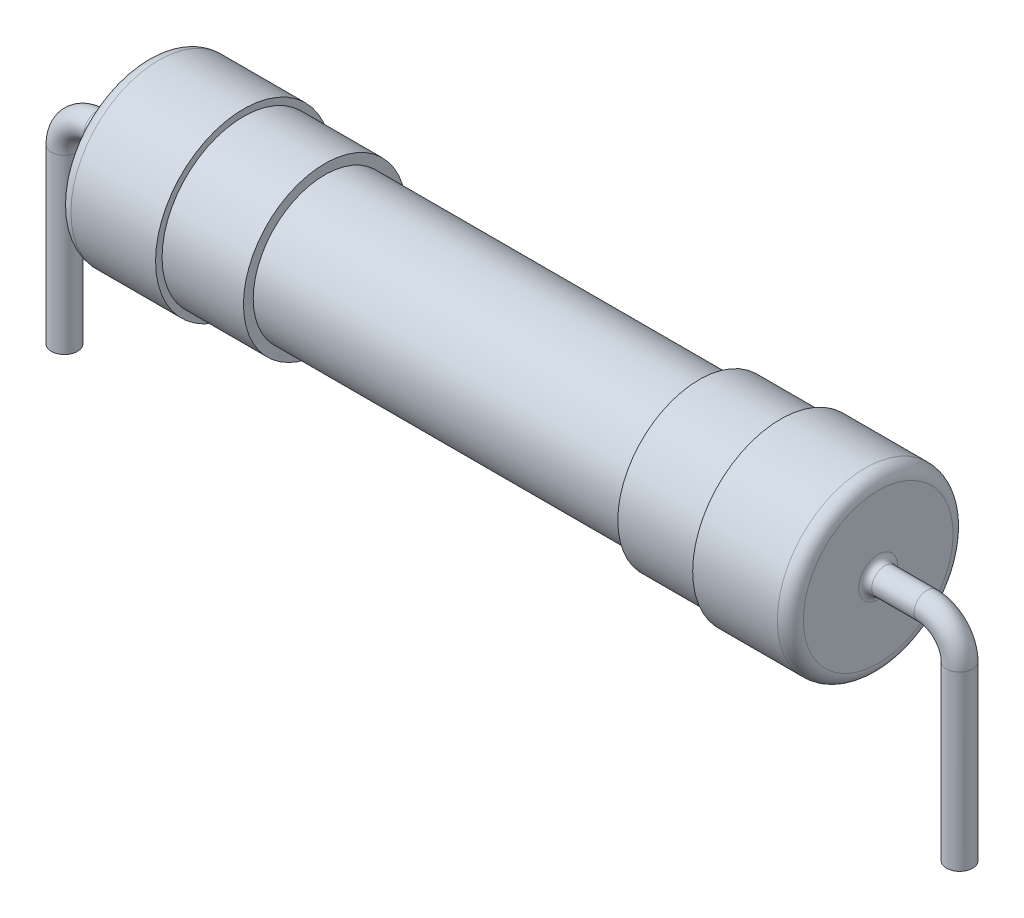
ISO-10303-21;
HEADER;
FILE_DESCRIPTION(('STEP AP214'),'2;1');
FILE_NAME('part.step','',(''),(''),'','','');
FILE_SCHEMA(('AUTOMOTIVE_DESIGN { 1 0 10303 214 1 1 1 1 }'));
ENDSEC;
DATA;
#1=APPLICATION_CONTEXT('core data for automotive mechanical design processes');
#2=APPLICATION_PROTOCOL_DEFINITION('international standard','automotive_design',2000,#1);
#3=PRODUCT_CONTEXT('',#1,'mechanical');
#4=PRODUCT('Part','Part','',(#3));
#5=PRODUCT_RELATED_PRODUCT_CATEGORY('part','',(#4));
#6=PRODUCT_DEFINITION_FORMATION('','',#4);
#7=PRODUCT_DEFINITION_CONTEXT('part definition',#1,'design');
#8=PRODUCT_DEFINITION('design','',#6,#7);
#9=PRODUCT_DEFINITION_SHAPE('','',#8);
#10=(LENGTH_UNIT() NAMED_UNIT(*) SI_UNIT(.MILLI.,.METRE.));
#11=(NAMED_UNIT(*) PLANE_ANGLE_UNIT() SI_UNIT($,.RADIAN.));
#12=(NAMED_UNIT(*) SI_UNIT($,.STERADIAN.) SOLID_ANGLE_UNIT());
#13=UNCERTAINTY_MEASURE_WITH_UNIT(LENGTH_MEASURE(1.E-05),#10,'distance_accuracy_value','');
#14=(GEOMETRIC_REPRESENTATION_CONTEXT(3) GLOBAL_UNCERTAINTY_ASSIGNED_CONTEXT((#13)) GLOBAL_UNIT_ASSIGNED_CONTEXT((#10,
#11,#12)) REPRESENTATION_CONTEXT('',''));
#15=CARTESIAN_POINT('',(0.,0.,0.));
#16=DIRECTION('',(0.,0.,1.));
#17=DIRECTION('',(1.,0.,0.));
#18=AXIS2_PLACEMENT_3D('',#15,#16,#17);
#19=CARTESIAN_POINT('',(13.75,-3.6,0.));
#20=DIRECTION('',(0.,-1.,0.));
#21=DIRECTION('',(1.,0.,0.));
#22=AXIS2_PLACEMENT_3D('',#19,#20,#21);
#23=PLANE('',#22);
#24=CARTESIAN_POINT('',(13.75,-3.6,0.));
#25=DIRECTION('',(0.,-1.,0.));
#26=DIRECTION('',(0.,0.,-1.));
#27=AXIS2_PLACEMENT_3D('',#24,#25,#26);
#28=CIRCLE('',#27,0.399999999999998);
#29=CARTESIAN_POINT('',(13.75,-3.6,-0.399999999999998));
#30=VERTEX_POINT('',#29);
#31=EDGE_CURVE('E276',#30,#30,#28,.F.);
#32=ORIENTED_EDGE('',*,*,#31,.F.);
#33=EDGE_LOOP('',(#32));
#34=FACE_BOUND('',#33,.T.);
#35=ADVANCED_FACE('F17',(#34),#23,.T.);
#36=CARTESIAN_POINT('',(13.75,1.7,0.));
#37=DIRECTION('',(0.,-1.,0.));
#38=DIRECTION('',(0.,0.,-1.));
#39=AXIS2_PLACEMENT_3D('',#36,#37,#38);
#40=CYLINDRICAL_SURFACE('',#39,0.399999999999998);
#41=CARTESIAN_POINT('',(13.75,1.7,0.));
#42=DIRECTION('',(0.,-1.,0.));
#43=DIRECTION('',(1.,0.,0.));
#44=AXIS2_PLACEMENT_3D('',#41,#42,#43);
#45=CIRCLE('',#44,0.399999999999998);
#46=CARTESIAN_POINT('',(14.15,1.7,0.));
#47=VERTEX_POINT('',#46);
#48=EDGE_CURVE('E274',#47,#47,#45,.F.);
#49=ORIENTED_EDGE('',*,*,#48,.F.);
#50=EDGE_LOOP('',(#49));
#51=FACE_BOUND('',#50,.T.);
#52=ORIENTED_EDGE('',*,*,#31,.T.);
#53=EDGE_LOOP('',(#52));
#54=FACE_BOUND('',#53,.T.);
#55=ADVANCED_FACE('F303',(#51,#54),#40,.T.);
#56=CARTESIAN_POINT('',(-13.75,-3.6,0.));
#57=DIRECTION('',(0.,-1.,0.));
#58=DIRECTION('',(1.,0.,0.));
#59=AXIS2_PLACEMENT_3D('',#56,#57,#58);
#60=PLANE('',#59);
#61=CARTESIAN_POINT('',(-13.75,-3.6,0.));
#62=DIRECTION('',(0.,-1.,0.));
#63=DIRECTION('',(0.,0.,-1.));
#64=AXIS2_PLACEMENT_3D('',#61,#62,#63);
#65=CIRCLE('',#64,0.399999999999998);
#66=CARTESIAN_POINT('',(-13.75,-3.6,-0.399999999999998));
#67=VERTEX_POINT('',#66);
#68=EDGE_CURVE('E273',#67,#67,#65,.F.);
#69=ORIENTED_EDGE('',*,*,#68,.F.);
#70=EDGE_LOOP('',(#69));
#71=FACE_BOUND('',#70,.T.);
#72=ADVANCED_FACE('F310',(#71),#60,.T.);
#73=CARTESIAN_POINT('',(-13.75,1.7,0.));
#74=DIRECTION('',(0.,-1.,0.));
#75=DIRECTION('',(0.,0.,-1.));
#76=AXIS2_PLACEMENT_3D('',#73,#74,#75);
#77=CYLINDRICAL_SURFACE('',#76,0.399999999999998);
#78=CARTESIAN_POINT('',(-13.75,1.7,0.));
#79=DIRECTION('',(0.,1.,0.));
#80=DIRECTION('',(-1.,0.,0.));
#81=AXIS2_PLACEMENT_3D('',#78,#79,#80);
#82=CIRCLE('',#81,0.399999999999998);
#83=CARTESIAN_POINT('',(-14.15,1.7,0.));
#84=VERTEX_POINT('',#83);
#85=EDGE_CURVE('E270',#84,#84,#82,.T.);
#86=ORIENTED_EDGE('',*,*,#85,.F.);
#87=EDGE_LOOP('',(#86));
#88=FACE_BOUND('',#87,.T.);
#89=ORIENTED_EDGE('',*,*,#68,.T.);
#90=EDGE_LOOP('',(#89));
#91=FACE_BOUND('',#90,.T.);
#92=ADVANCED_FACE('F265',(#88,#91),#77,.T.);
#93=CARTESIAN_POINT('',(12.75,1.7,0.));
#94=DIRECTION('',(0.,0.,-1.));
#95=DIRECTION('',(-1.,0.,0.));
#96=AXIS2_PLACEMENT_3D('',#93,#94,#95);
#97=TOROIDAL_SURFACE('',#96,0.999999999999999,0.399999999999998);
#98=CARTESIAN_POINT('',(12.75,2.7,0.));
#99=DIRECTION('',(1.,0.,0.));
#100=DIRECTION('',(0.,1.,0.));
#101=AXIS2_PLACEMENT_3D('',#98,#99,#100);
#102=CIRCLE('',#101,0.399999999999998);
#103=CARTESIAN_POINT('',(12.75,3.1,0.));
#104=VERTEX_POINT('',#103);
#105=EDGE_CURVE('E252',#104,#104,#102,.F.);
#106=ORIENTED_EDGE('',*,*,#105,.F.);
#107=EDGE_LOOP('',(#106));
#108=FACE_BOUND('',#107,.T.);
#109=ORIENTED_EDGE('',*,*,#48,.T.);
#110=EDGE_LOOP('',(#109));
#111=FACE_BOUND('',#110,.T.);
#112=ADVANCED_FACE('F261',(#108,#111),#97,.T.);
#113=CARTESIAN_POINT('',(-12.75,1.7,0.));
#114=DIRECTION('',(0.,0.,-1.));
#115=DIRECTION('',(-1.,0.,0.));
#116=AXIS2_PLACEMENT_3D('',#113,#114,#115);
#117=TOROIDAL_SURFACE('',#116,0.999999999999999,0.399999999999998);
#118=CARTESIAN_POINT('',(-12.75,2.7,0.));
#119=DIRECTION('',(1.,0.,0.));
#120=DIRECTION('',(0.,1.,0.));
#121=AXIS2_PLACEMENT_3D('',#118,#119,#120);
#122=CIRCLE('',#121,0.399999999999998);
#123=CARTESIAN_POINT('',(-12.75,3.1,0.));
#124=VERTEX_POINT('',#123);
#125=EDGE_CURVE('E249',#124,#124,#122,.T.);
#126=ORIENTED_EDGE('',*,*,#125,.F.);
#127=EDGE_LOOP('',(#126));
#128=FACE_BOUND('',#127,.T.);
#129=ORIENTED_EDGE('',*,*,#85,.T.);
#130=EDGE_LOOP('',(#129));
#131=FACE_BOUND('',#130,.T.);
#132=ADVANCED_FACE('F257',(#128,#131),#117,.T.);
#133=CARTESIAN_POINT('',(-12.75,2.7,0.));
#134=DIRECTION('',(1.,0.,0.));
#135=DIRECTION('',(0.,1.,0.));
#136=AXIS2_PLACEMENT_3D('',#133,#134,#135);
#137=CYLINDRICAL_SURFACE('',#136,0.399999999999998);
#138=ORIENTED_EDGE('',*,*,#105,.T.);
#139=EDGE_LOOP('',(#138));
#140=FACE_BOUND('',#139,.T.);
#141=CARTESIAN_POINT('',(11.45,2.7,0.));
#142=DIRECTION('',(1.,0.,0.));
#143=DIRECTION('',(0.,0.,-1.));
#144=AXIS2_PLACEMENT_3D('',#141,#142,#143);
#145=CIRCLE('',#144,0.399999999999998);
#146=CARTESIAN_POINT('',(11.45,2.7,-0.399999999999998));
#147=VERTEX_POINT('',#146);
#148=EDGE_CURVE('E246',#147,#147,#145,.T.);
#149=ORIENTED_EDGE('',*,*,#148,.T.);
#150=EDGE_LOOP('',(#149));
#151=FACE_BOUND('',#150,.T.);
#152=ADVANCED_FACE('F260',(#140,#151),#137,.T.);
#153=CARTESIAN_POINT('',(-12.75,2.7,0.));
#154=DIRECTION('',(1.,0.,0.));
#155=DIRECTION('',(0.,1.,0.));
#156=AXIS2_PLACEMENT_3D('',#153,#154,#155);
#157=CYLINDRICAL_SURFACE('',#156,0.399999999999998);
#158=ORIENTED_EDGE('',*,*,#125,.T.);
#159=EDGE_LOOP('',(#158));
#160=FACE_BOUND('',#159,.T.);
#161=CARTESIAN_POINT('',(-11.45,2.7,0.));
#162=DIRECTION('',(-1.,0.,0.));
#163=DIRECTION('',(0.,0.,1.));
#164=AXIS2_PLACEMENT_3D('',#161,#162,#163);
#165=CIRCLE('',#164,0.399999999999998);
#166=CARTESIAN_POINT('',(-11.45,2.7,0.399999999999998));
#167=VERTEX_POINT('',#166);
#168=EDGE_CURVE('E64',#167,#167,#165,.T.);
#169=ORIENTED_EDGE('',*,*,#168,.T.);
#170=EDGE_LOOP('',(#169));
#171=FACE_BOUND('',#170,.T.);
#172=ADVANCED_FACE('F232',(#160,#171),#157,.T.);
#173=CARTESIAN_POINT('',(11.45,2.7,0.));
#174=DIRECTION('',(1.,0.,0.));
#175=DIRECTION('',(0.,0.,-1.));
#176=AXIS2_PLACEMENT_3D('',#173,#174,#175);
#177=TOROIDAL_SURFACE('',#176,0.599999999999998,0.2);
#178=ORIENTED_EDGE('',*,*,#148,.F.);
#179=EDGE_LOOP('',(#178));
#180=FACE_BOUND('',#179,.T.);
#181=CARTESIAN_POINT('',(11.25,2.7,0.));
#182=DIRECTION('',(1.,0.,0.));
#183=DIRECTION('',(0.,0.,1.));
#184=AXIS2_PLACEMENT_3D('',#181,#182,#183);
#185=CIRCLE('',#184,0.599999999999998);
#186=CARTESIAN_POINT('',(11.25,2.7,-0.599999999999998));
#187=VERTEX_POINT('',#186);
#188=CARTESIAN_POINT('',(11.25,2.7,0.599999999999998));
#189=VERTEX_POINT('',#188);
#190=EDGE_CURVE('E60',#187,#189,#185,.F.);
#191=ORIENTED_EDGE('',*,*,#190,.F.);
#192=CARTESIAN_POINT('',(11.25,2.7,0.));
#193=DIRECTION('',(1.,0.,0.));
#194=DIRECTION('',(0.,0.,-1.));
#195=AXIS2_PLACEMENT_3D('',#192,#193,#194);
#196=CIRCLE('',#195,0.599999999999998);
#197=EDGE_CURVE('E57',#189,#187,#196,.F.);
#198=ORIENTED_EDGE('',*,*,#197,.F.);
#199=EDGE_LOOP('',(#191,#198));
#200=FACE_BOUND('',#199,.T.);
#201=ADVANCED_FACE('F61',(#180,#200),#177,.F.);
#202=CARTESIAN_POINT('',(-11.45,2.7,0.));
#203=DIRECTION('',(-1.,0.,0.));
#204=DIRECTION('',(0.,0.,1.));
#205=AXIS2_PLACEMENT_3D('',#202,#203,#204);
#206=TOROIDAL_SURFACE('',#205,0.599999999999998,0.2);
#207=ORIENTED_EDGE('',*,*,#168,.F.);
#208=EDGE_LOOP('',(#207));
#209=FACE_BOUND('',#208,.T.);
#210=CARTESIAN_POINT('',(-11.25,2.7,0.));
#211=DIRECTION('',(-1.,0.,0.));
#212=DIRECTION('',(0.,0.,-1.));
#213=AXIS2_PLACEMENT_3D('',#210,#211,#212);
#214=CIRCLE('',#213,0.599999999999998);
#215=CARTESIAN_POINT('',(-11.25,2.7,0.599999999999998));
#216=VERTEX_POINT('',#215);
#217=CARTESIAN_POINT('',(-11.25,2.7,-0.599999999999998));
#218=VERTEX_POINT('',#217);
#219=EDGE_CURVE('E68',#216,#218,#214,.F.);
#220=ORIENTED_EDGE('',*,*,#219,.F.);
#221=CARTESIAN_POINT('',(-11.25,2.7,0.));
#222=DIRECTION('',(-1.,0.,0.));
#223=DIRECTION('',(0.,0.,1.));
#224=AXIS2_PLACEMENT_3D('',#221,#222,#223);
#225=CIRCLE('',#224,0.599999999999998);
#226=EDGE_CURVE('E156',#218,#216,#225,.F.);
#227=ORIENTED_EDGE('',*,*,#226,.F.);
#228=EDGE_LOOP('',(#220,#227));
#229=FACE_BOUND('',#228,.T.);
#230=ADVANCED_FACE('F88',(#209,#229),#206,.F.);
#231=CARTESIAN_POINT('',(11.25,0.4,0.));
#232=DIRECTION('',(1.,0.,0.));
#233=DIRECTION('',(0.,0.,-1.));
#234=AXIS2_PLACEMENT_3D('',#231,#232,#233);
#235=PLANE('',#234);
#236=CARTESIAN_POINT('',(11.25,2.7,0.));
#237=DIRECTION('',(-1.,0.,0.));
#238=DIRECTION('',(0.,0.,1.));
#239=AXIS2_PLACEMENT_3D('',#236,#237,#238);
#240=CIRCLE('',#239,2.3);
#241=CARTESIAN_POINT('',(11.25,2.7,2.3));
#242=VERTEX_POINT('',#241);
#243=CARTESIAN_POINT('',(11.25,2.7,-2.3));
#244=VERTEX_POINT('',#243);
#245=EDGE_CURVE('E195',#242,#244,#240,.T.);
#246=ORIENTED_EDGE('',*,*,#245,.F.);
#247=CARTESIAN_POINT('',(11.25,2.7,0.));
#248=DIRECTION('',(-1.,0.,0.));
#249=DIRECTION('',(0.,0.,-1.));
#250=AXIS2_PLACEMENT_3D('',#247,#248,#249);
#251=CIRCLE('',#250,2.3);
#252=EDGE_CURVE('E108',#244,#242,#251,.T.);
#253=ORIENTED_EDGE('',*,*,#252,.F.);
#254=EDGE_LOOP('',(#246,#253));
#255=FACE_BOUND('',#254,.T.);
#256=ORIENTED_EDGE('',*,*,#190,.T.);
#257=ORIENTED_EDGE('',*,*,#197,.T.);
#258=EDGE_LOOP('',(#256,#257));
#259=FACE_BOUND('',#258,.T.);
#260=ADVANCED_FACE('F67',(#255,#259),#235,.T.);
#261=CARTESIAN_POINT('',(-11.25,2.7,0.));
#262=DIRECTION('',(-1.,0.,0.));
#263=DIRECTION('',(0.,0.,1.));
#264=AXIS2_PLACEMENT_3D('',#261,#262,#263);
#265=PLANE('',#264);
#266=CARTESIAN_POINT('',(-11.25,2.7,0.));
#267=DIRECTION('',(1.,0.,0.));
#268=DIRECTION('',(0.,0.,-1.));
#269=AXIS2_PLACEMENT_3D('',#266,#267,#268);
#270=CIRCLE('',#269,2.3);
#271=CARTESIAN_POINT('',(-11.25,2.7,-2.3));
#272=VERTEX_POINT('',#271);
#273=CARTESIAN_POINT('',(-11.25,2.7,2.3));
#274=VERTEX_POINT('',#273);
#275=EDGE_CURVE('E36',#272,#274,#270,.T.);
#276=ORIENTED_EDGE('',*,*,#275,.F.);
#277=CARTESIAN_POINT('',(-11.25,2.7,0.));
#278=DIRECTION('',(1.,0.,0.));
#279=DIRECTION('',(0.,0.,1.));
#280=AXIS2_PLACEMENT_3D('',#277,#278,#279);
#281=CIRCLE('',#280,2.3);
#282=EDGE_CURVE('E176',#274,#272,#281,.T.);
#283=ORIENTED_EDGE('',*,*,#282,.F.);
#284=EDGE_LOOP('',(#276,#283));
#285=FACE_BOUND('',#284,.T.);
#286=ORIENTED_EDGE('',*,*,#219,.T.);
#287=ORIENTED_EDGE('',*,*,#226,.T.);
#288=EDGE_LOOP('',(#286,#287));
#289=FACE_BOUND('',#288,.T.);
#290=ADVANCED_FACE('F87',(#285,#289),#265,.T.);
#291=CARTESIAN_POINT('',(10.85,2.7,0.));
#292=DIRECTION('',(-1.,0.,0.));
#293=DIRECTION('',(0.,0.,1.));
#294=AXIS2_PLACEMENT_3D('',#291,#292,#293);
#295=TOROIDAL_SURFACE('',#294,2.3,0.4);
#296=ORIENTED_EDGE('',*,*,#245,.T.);
#297=ORIENTED_EDGE('',*,*,#252,.T.);
#298=EDGE_LOOP('',(#296,#297));
#299=FACE_BOUND('',#298,.T.);
#300=CARTESIAN_POINT('',(10.85,2.7,0.));
#301=DIRECTION('',(-1.,0.,0.));
#302=DIRECTION('',(0.,0.,1.));
#303=AXIS2_PLACEMENT_3D('',#300,#301,#302);
#304=CIRCLE('',#303,2.7);
#305=CARTESIAN_POINT('',(10.85,2.7,2.7));
#306=VERTEX_POINT('',#305);
#307=EDGE_CURVE('E141',#306,#306,#304,.T.);
#308=ORIENTED_EDGE('',*,*,#307,.F.);
#309=EDGE_LOOP('',(#308));
#310=FACE_BOUND('',#309,.T.);
#311=ADVANCED_FACE('F123',(#299,#310),#295,.T.);
#312=CARTESIAN_POINT('',(-10.85,2.7,0.));
#313=DIRECTION('',(-1.,0.,0.));
#314=DIRECTION('',(0.,0.,1.));
#315=AXIS2_PLACEMENT_3D('',#312,#313,#314);
#316=TOROIDAL_SURFACE('',#315,2.3,0.4);
#317=CARTESIAN_POINT('',(-10.85,2.7,0.));
#318=DIRECTION('',(-1.,0.,0.));
#319=DIRECTION('',(0.,0.,1.));
#320=AXIS2_PLACEMENT_3D('',#317,#318,#319);
#321=CIRCLE('',#320,2.7);
#322=CARTESIAN_POINT('',(-10.85,2.7,2.7));
#323=VERTEX_POINT('',#322);
#324=EDGE_CURVE('E194',#323,#323,#321,.F.);
#325=ORIENTED_EDGE('',*,*,#324,.F.);
#326=EDGE_LOOP('',(#325));
#327=FACE_BOUND('',#326,.T.);
#328=ORIENTED_EDGE('',*,*,#282,.T.);
#329=ORIENTED_EDGE('',*,*,#275,.T.);
#330=EDGE_LOOP('',(#328,#329));
#331=FACE_BOUND('',#330,.T.);
#332=ADVANCED_FACE('F133',(#327,#331),#316,.T.);
#333=CARTESIAN_POINT('',(-18.,2.7,0.));
#334=DIRECTION('',(-1.,0.,0.));
#335=DIRECTION('',(0.,0.,1.));
#336=AXIS2_PLACEMENT_3D('',#333,#334,#335);
#337=CYLINDRICAL_SURFACE('',#336,2.7);
#338=ORIENTED_EDGE('',*,*,#307,.T.);
#339=EDGE_LOOP('',(#338));
#340=FACE_BOUND('',#339,.T.);
#341=CARTESIAN_POINT('',(8.25,2.7,0.));
#342=DIRECTION('',(-1.,0.,0.));
#343=DIRECTION('',(0.,0.,1.));
#344=AXIS2_PLACEMENT_3D('',#341,#342,#343);
#345=CIRCLE('',#344,2.7);
#346=CARTESIAN_POINT('',(8.25,2.7,2.7));
#347=VERTEX_POINT('',#346);
#348=EDGE_CURVE('E295',#347,#347,#345,.T.);
#349=ORIENTED_EDGE('',*,*,#348,.F.);
#350=EDGE_LOOP('',(#349));
#351=FACE_BOUND('',#350,.T.);
#352=ADVANCED_FACE('F346',(#340,#351),#337,.T.);
#353=CARTESIAN_POINT('',(-18.,2.7,0.));
#354=DIRECTION('',(-1.,0.,0.));
#355=DIRECTION('',(0.,0.,1.));
#356=AXIS2_PLACEMENT_3D('',#353,#354,#355);
#357=CYLINDRICAL_SURFACE('',#356,2.7);
#358=CARTESIAN_POINT('',(-8.25,2.7,0.));
#359=DIRECTION('',(-1.,0.,0.));
#360=DIRECTION('',(0.,0.,1.));
#361=AXIS2_PLACEMENT_3D('',#358,#359,#360);
#362=CIRCLE('',#361,2.7);
#363=CARTESIAN_POINT('',(-8.25,2.7,2.7));
#364=VERTEX_POINT('',#363);
#365=EDGE_CURVE('E292',#364,#364,#362,.F.);
#366=ORIENTED_EDGE('',*,*,#365,.F.);
#367=EDGE_LOOP('',(#366));
#368=FACE_BOUND('',#367,.T.);
#369=ORIENTED_EDGE('',*,*,#324,.T.);
#370=EDGE_LOOP('',(#369));
#371=FACE_BOUND('',#370,.T.);
#372=ADVANCED_FACE('F343',(#368,#371),#357,.T.);
#373=CARTESIAN_POINT('',(8.25,0.2,0.));
#374=DIRECTION('',(-1.,0.,0.));
#375=DIRECTION('',(0.,0.,1.));
#376=AXIS2_PLACEMENT_3D('',#373,#374,#375);
#377=PLANE('',#376);
#378=CARTESIAN_POINT('',(8.25,2.7,0.));
#379=DIRECTION('',(-1.,0.,0.));
#380=DIRECTION('',(0.,0.,1.));
#381=AXIS2_PLACEMENT_3D('',#378,#379,#380);
#382=CIRCLE('',#381,2.5);
#383=CARTESIAN_POINT('',(8.25,2.7,2.5));
#384=VERTEX_POINT('',#383);
#385=EDGE_CURVE('E289',#384,#384,#382,.T.);
#386=ORIENTED_EDGE('',*,*,#385,.F.);
#387=EDGE_LOOP('',(#386));
#388=FACE_BOUND('',#387,.T.);
#389=ORIENTED_EDGE('',*,*,#348,.T.);
#390=EDGE_LOOP('',(#389));
#391=FACE_BOUND('',#390,.T.);
#392=ADVANCED_FACE('F339',(#388,#391),#377,.T.);
#393=CARTESIAN_POINT('',(-8.25,0.,0.));
#394=DIRECTION('',(1.,0.,0.));
#395=DIRECTION('',(0.,0.,-1.));
#396=AXIS2_PLACEMENT_3D('',#393,#394,#395);
#397=PLANE('',#396);
#398=ORIENTED_EDGE('',*,*,#365,.T.);
#399=EDGE_LOOP('',(#398));
#400=FACE_BOUND('',#399,.T.);
#401=CARTESIAN_POINT('',(-8.25,2.7,0.));
#402=DIRECTION('',(-1.,0.,0.));
#403=DIRECTION('',(0.,0.,1.));
#404=AXIS2_PLACEMENT_3D('',#401,#402,#403);
#405=CIRCLE('',#404,2.5);
#406=CARTESIAN_POINT('',(-8.25,2.7,2.5));
#407=VERTEX_POINT('',#406);
#408=EDGE_CURVE('E286',#407,#407,#405,.F.);
#409=ORIENTED_EDGE('',*,*,#408,.F.);
#410=EDGE_LOOP('',(#409));
#411=FACE_BOUND('',#410,.T.);
#412=ADVANCED_FACE('F335',(#400,#411),#397,.T.);
#413=CARTESIAN_POINT('',(-18.,2.7,0.));
#414=DIRECTION('',(-1.,0.,0.));
#415=DIRECTION('',(0.,0.,1.));
#416=AXIS2_PLACEMENT_3D('',#413,#414,#415);
#417=CYLINDRICAL_SURFACE('',#416,2.5);
#418=ORIENTED_EDGE('',*,*,#385,.T.);
#419=EDGE_LOOP('',(#418));
#420=FACE_BOUND('',#419,.T.);
#421=CARTESIAN_POINT('',(5.75,2.7,0.));
#422=DIRECTION('',(-1.,0.,0.));
#423=DIRECTION('',(0.,0.,1.));
#424=AXIS2_PLACEMENT_3D('',#421,#422,#423);
#425=CIRCLE('',#424,2.5);
#426=CARTESIAN_POINT('',(5.75,2.7,2.5));
#427=VERTEX_POINT('',#426);
#428=EDGE_CURVE('E283',#427,#427,#425,.T.);
#429=ORIENTED_EDGE('',*,*,#428,.F.);
#430=EDGE_LOOP('',(#429));
#431=FACE_BOUND('',#430,.T.);
#432=ADVANCED_FACE('F331',(#420,#431),#417,.T.);
#433=CARTESIAN_POINT('',(-18.,2.7,0.));
#434=DIRECTION('',(-1.,0.,0.));
#435=DIRECTION('',(0.,0.,1.));
#436=AXIS2_PLACEMENT_3D('',#433,#434,#435);
#437=CYLINDRICAL_SURFACE('',#436,2.5);
#438=CARTESIAN_POINT('',(-5.75,2.7,0.));
#439=DIRECTION('',(-1.,0.,0.));
#440=DIRECTION('',(0.,0.,1.));
#441=AXIS2_PLACEMENT_3D('',#438,#439,#440);
#442=CIRCLE('',#441,2.5);
#443=CARTESIAN_POINT('',(-5.75,2.7,2.5));
#444=VERTEX_POINT('',#443);
#445=EDGE_CURVE('E280',#444,#444,#442,.F.);
#446=ORIENTED_EDGE('',*,*,#445,.F.);
#447=EDGE_LOOP('',(#446));
#448=FACE_BOUND('',#447,.T.);
#449=ORIENTED_EDGE('',*,*,#408,.T.);
#450=EDGE_LOOP('',(#449));
#451=FACE_BOUND('',#450,.T.);
#452=ADVANCED_FACE('F327',(#448,#451),#437,.T.);
#453=CARTESIAN_POINT('',(5.75,0.5,0.));
#454=DIRECTION('',(-1.,0.,0.));
#455=DIRECTION('',(0.,0.,1.));
#456=AXIS2_PLACEMENT_3D('',#453,#454,#455);
#457=PLANE('',#456);
#458=CARTESIAN_POINT('',(5.75,2.7,0.));
#459=DIRECTION('',(-1.,0.,0.));
#460=DIRECTION('',(0.,0.,1.));
#461=AXIS2_PLACEMENT_3D('',#458,#459,#460);
#462=CIRCLE('',#461,2.2);
#463=CARTESIAN_POINT('',(5.75,2.7,2.2));
#464=VERTEX_POINT('',#463);
#465=EDGE_CURVE('E28',#464,#464,#462,.T.);
#466=ORIENTED_EDGE('',*,*,#465,.F.);
#467=EDGE_LOOP('',(#466));
#468=FACE_BOUND('',#467,.T.);
#469=ORIENTED_EDGE('',*,*,#428,.T.);
#470=EDGE_LOOP('',(#469));
#471=FACE_BOUND('',#470,.T.);
#472=ADVANCED_FACE('F320',(#468,#471),#457,.T.);
#473=CARTESIAN_POINT('',(-5.75,0.2,0.));
#474=DIRECTION('',(1.,0.,0.));
#475=DIRECTION('',(0.,0.,-1.));
#476=AXIS2_PLACEMENT_3D('',#473,#474,#475);
#477=PLANE('',#476);
#478=ORIENTED_EDGE('',*,*,#445,.T.);
#479=EDGE_LOOP('',(#478));
#480=FACE_BOUND('',#479,.T.);
#481=CARTESIAN_POINT('',(-5.75,2.7,0.));
#482=DIRECTION('',(-1.,0.,0.));
#483=DIRECTION('',(0.,0.,1.));
#484=AXIS2_PLACEMENT_3D('',#481,#482,#483);
#485=CIRCLE('',#484,2.2);
#486=CARTESIAN_POINT('',(-5.75,2.7,2.2));
#487=VERTEX_POINT('',#486);
#488=EDGE_CURVE('E11',#487,#487,#485,.F.);
#489=ORIENTED_EDGE('',*,*,#488,.F.);
#490=EDGE_LOOP('',(#489));
#491=FACE_BOUND('',#490,.T.);
#492=ADVANCED_FACE('F314',(#480,#491),#477,.T.);
#493=CARTESIAN_POINT('',(-18.,2.7,0.));
#494=DIRECTION('',(-1.,0.,0.));
#495=DIRECTION('',(0.,0.,1.));
#496=AXIS2_PLACEMENT_3D('',#493,#494,#495);
#497=CYLINDRICAL_SURFACE('',#496,2.2);
#498=ORIENTED_EDGE('',*,*,#465,.T.);
#499=EDGE_LOOP('',(#498));
#500=FACE_BOUND('',#499,.T.);
#501=ORIENTED_EDGE('',*,*,#488,.T.);
#502=EDGE_LOOP('',(#501));
#503=FACE_BOUND('',#502,.T.);
#504=ADVANCED_FACE('F312',(#500,#503),#497,.T.);
#505=CLOSED_SHELL('',(#35,#55,#72,#92,#112,#132,#152,#172,#201,#230,#260,#290,#311,#332,#352,
#372,#392,#412,#432,#452,#472,#492,#504));
#506=MANIFOLD_SOLID_BREP('B1',#505);
#507=ADVANCED_BREP_SHAPE_REPRESENTATION('',(#18,#506),#14);
#508=SHAPE_DEFINITION_REPRESENTATION(#9,#507);
ENDSEC;
END-ISO-10303-21;
